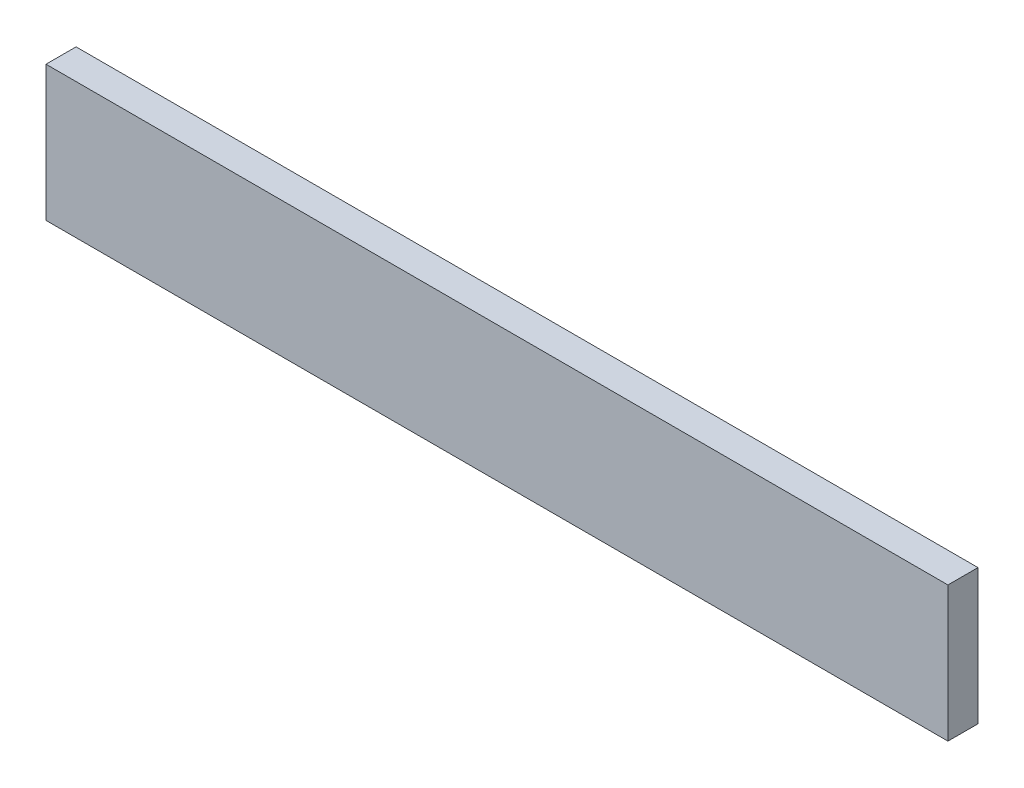
ISO-10303-21;
HEADER;
FILE_DESCRIPTION(('STEP AP214'),'2;1');
FILE_NAME('part.step','',(''),(''),'','','');
FILE_SCHEMA(('AUTOMOTIVE_DESIGN { 1 0 10303 214 1 1 1 1 }'));
ENDSEC;
DATA;
#1=APPLICATION_CONTEXT('core data for automotive mechanical design processes');
#2=APPLICATION_PROTOCOL_DEFINITION('international standard','automotive_design',2000,#1);
#3=PRODUCT_CONTEXT('',#1,'mechanical');
#4=PRODUCT('Part','Part','',(#3));
#5=PRODUCT_RELATED_PRODUCT_CATEGORY('part','',(#4));
#6=PRODUCT_DEFINITION_FORMATION('','',#4);
#7=PRODUCT_DEFINITION_CONTEXT('part definition',#1,'design');
#8=PRODUCT_DEFINITION('design','',#6,#7);
#9=PRODUCT_DEFINITION_SHAPE('','',#8);
#10=(LENGTH_UNIT() NAMED_UNIT(*) SI_UNIT(.MILLI.,.METRE.));
#11=(NAMED_UNIT(*) PLANE_ANGLE_UNIT() SI_UNIT($,.RADIAN.));
#12=(NAMED_UNIT(*) SI_UNIT($,.STERADIAN.) SOLID_ANGLE_UNIT());
#13=UNCERTAINTY_MEASURE_WITH_UNIT(LENGTH_MEASURE(1.E-05),#10,'distance_accuracy_value','');
#14=(GEOMETRIC_REPRESENTATION_CONTEXT(3) GLOBAL_UNCERTAINTY_ASSIGNED_CONTEXT((#13)) GLOBAL_UNIT_ASSIGNED_CONTEXT((#10,
#11,#12)) REPRESENTATION_CONTEXT('',''));
#15=CARTESIAN_POINT('',(0.,0.,0.));
#16=DIRECTION('',(0.,0.,1.));
#17=DIRECTION('',(1.,0.,0.));
#18=AXIS2_PLACEMENT_3D('',#15,#16,#17);
#19=CARTESIAN_POINT('',(-439.049402450625,4426.93965889721,5.08));
#20=DIRECTION('',(-1.,0.,0.));
#21=DIRECTION('',(0.,0.,1.));
#22=AXIS2_PLACEMENT_3D('',#19,#20,#21);
#23=PLANE('',#22);
#24=DIRECTION('',(0.,1.,0.));
#25=VECTOR('',#24,1.);
#26=CARTESIAN_POINT('',(-439.049402450625,4426.93965889721,0.));
#27=LINE('',#26,#25);
#28=CARTESIAN_POINT('',(-439.049402450625,4404.07965889721,0.));
#29=VERTEX_POINT('',#28);
#30=CARTESIAN_POINT('',(-439.049402450625,4426.93965889721,0.));
#31=VERTEX_POINT('',#30);
#32=EDGE_CURVE('E106',#29,#31,#27,.T.);
#33=ORIENTED_EDGE('',*,*,#32,.T.);
#34=DIRECTION('',(0.,0.,-1.));
#35=VECTOR('',#34,1.);
#36=CARTESIAN_POINT('',(-439.049402450625,4426.93965889721,5.08));
#37=LINE('',#36,#35);
#38=CARTESIAN_POINT('',(-439.049402450625,4426.93965889721,5.08));
#39=VERTEX_POINT('',#38);
#40=EDGE_CURVE('E11',#39,#31,#37,.T.);
#41=ORIENTED_EDGE('',*,*,#40,.F.);
#42=DIRECTION('',(0.,1.,0.));
#43=VECTOR('',#42,1.);
#44=CARTESIAN_POINT('',(-439.049402450625,4426.93965889721,5.08));
#45=LINE('',#44,#43);
#46=CARTESIAN_POINT('',(-439.049402450625,4404.07965889721,5.08));
#47=VERTEX_POINT('',#46);
#48=EDGE_CURVE('E94',#47,#39,#45,.T.);
#49=ORIENTED_EDGE('',*,*,#48,.F.);
#50=DIRECTION('',(0.,0.,-1.));
#51=VECTOR('',#50,1.);
#52=CARTESIAN_POINT('',(-439.049402450625,4404.07965889721,5.08));
#53=LINE('',#52,#51);
#54=EDGE_CURVE('E102',#47,#29,#53,.T.);
#55=ORIENTED_EDGE('',*,*,#54,.T.);
#56=EDGE_LOOP('',(#33,#41,#49,#55));
#57=FACE_BOUND('',#56,.T.);
#58=ADVANCED_FACE('F43',(#57),#23,.F.);
#59=CARTESIAN_POINT('',(-591.449402450623,4426.93965889721,5.08));
#60=DIRECTION('',(0.,-1.,0.));
#61=DIRECTION('',(0.,0.,-1.));
#62=AXIS2_PLACEMENT_3D('',#59,#60,#61);
#63=PLANE('',#62);
#64=DIRECTION('',(-1.,0.,0.));
#65=VECTOR('',#64,1.);
#66=CARTESIAN_POINT('',(-591.449402450623,4426.93965889721,0.));
#67=LINE('',#66,#65);
#68=CARTESIAN_POINT('',(-591.449402450623,4426.93965889721,0.));
#69=VERTEX_POINT('',#68);
#70=EDGE_CURVE('E98',#31,#69,#67,.T.);
#71=ORIENTED_EDGE('',*,*,#70,.T.);
#72=DIRECTION('',(0.,0.,-1.));
#73=VECTOR('',#72,1.);
#74=CARTESIAN_POINT('',(-591.449402450623,4426.93965889721,5.08));
#75=LINE('',#74,#73);
#76=CARTESIAN_POINT('',(-591.449402450623,4426.93965889721,5.08));
#77=VERTEX_POINT('',#76);
#78=EDGE_CURVE('E51',#77,#69,#75,.T.);
#79=ORIENTED_EDGE('',*,*,#78,.F.);
#80=DIRECTION('',(-1.,0.,0.));
#81=VECTOR('',#80,1.);
#82=CARTESIAN_POINT('',(-591.449402450623,4426.93965889721,5.08));
#83=LINE('',#82,#81);
#84=EDGE_CURVE('E89',#39,#77,#83,.T.);
#85=ORIENTED_EDGE('',*,*,#84,.F.);
#86=ORIENTED_EDGE('',*,*,#40,.T.);
#87=EDGE_LOOP('',(#71,#79,#85,#86));
#88=FACE_BOUND('',#87,.T.);
#89=ADVANCED_FACE('F97',(#88),#63,.F.);
#90=CARTESIAN_POINT('',(-591.449402450623,4426.93965889721,5.08));
#91=DIRECTION('',(1.,0.,0.));
#92=DIRECTION('',(0.,0.,-1.));
#93=AXIS2_PLACEMENT_3D('',#90,#91,#92);
#94=PLANE('',#93);
#95=DIRECTION('',(0.,-1.,0.));
#96=VECTOR('',#95,1.);
#97=CARTESIAN_POINT('',(-591.449402450623,4426.93965889721,0.));
#98=LINE('',#97,#96);
#99=CARTESIAN_POINT('',(-591.449402450623,4404.07965889721,0.));
#100=VERTEX_POINT('',#99);
#101=EDGE_CURVE('E76',#69,#100,#98,.T.);
#102=ORIENTED_EDGE('',*,*,#101,.T.);
#103=DIRECTION('',(0.,0.,-1.));
#104=VECTOR('',#103,1.);
#105=CARTESIAN_POINT('',(-591.449402450623,4404.07965889721,5.08));
#106=LINE('',#105,#104);
#107=CARTESIAN_POINT('',(-591.449402450623,4404.07965889721,5.08));
#108=VERTEX_POINT('',#107);
#109=EDGE_CURVE('E99',#108,#100,#106,.T.);
#110=ORIENTED_EDGE('',*,*,#109,.F.);
#111=DIRECTION('',(0.,-1.,0.));
#112=VECTOR('',#111,1.);
#113=CARTESIAN_POINT('',(-591.449402450623,4426.93965889721,5.08));
#114=LINE('',#113,#112);
#115=EDGE_CURVE('E92',#77,#108,#114,.T.);
#116=ORIENTED_EDGE('',*,*,#115,.F.);
#117=ORIENTED_EDGE('',*,*,#78,.T.);
#118=EDGE_LOOP('',(#102,#110,#116,#117));
#119=FACE_BOUND('',#118,.T.);
#120=ADVANCED_FACE('F100',(#119),#94,.F.);
#121=CARTESIAN_POINT('',(-591.449402450623,4404.07965889721,5.08));
#122=DIRECTION('',(0.,1.,0.));
#123=DIRECTION('',(0.,0.,1.));
#124=AXIS2_PLACEMENT_3D('',#121,#122,#123);
#125=PLANE('',#124);
#126=DIRECTION('',(1.,0.,0.));
#127=VECTOR('',#126,1.);
#128=CARTESIAN_POINT('',(-591.449402450623,4404.07965889721,0.));
#129=LINE('',#128,#127);
#130=EDGE_CURVE('E82',#100,#29,#129,.T.);
#131=ORIENTED_EDGE('',*,*,#130,.T.);
#132=ORIENTED_EDGE('',*,*,#54,.F.);
#133=DIRECTION('',(1.,0.,0.));
#134=VECTOR('',#133,1.);
#135=CARTESIAN_POINT('',(-591.449402450623,4404.07965889721,5.08));
#136=LINE('',#135,#134);
#137=EDGE_CURVE('E59',#108,#47,#136,.T.);
#138=ORIENTED_EDGE('',*,*,#137,.F.);
#139=ORIENTED_EDGE('',*,*,#109,.T.);
#140=EDGE_LOOP('',(#131,#132,#138,#139));
#141=FACE_BOUND('',#140,.T.);
#142=ADVANCED_FACE('F113',(#141),#125,.F.);
#143=CARTESIAN_POINT('',(0.,0.,5.08));
#144=DIRECTION('',(0.,0.,1.));
#145=DIRECTION('',(1.,0.,0.));
#146=AXIS2_PLACEMENT_3D('',#143,#144,#145);
#147=PLANE('',#146);
#148=ORIENTED_EDGE('',*,*,#48,.T.);
#149=ORIENTED_EDGE('',*,*,#84,.T.);
#150=ORIENTED_EDGE('',*,*,#115,.T.);
#151=ORIENTED_EDGE('',*,*,#137,.T.);
#152=EDGE_LOOP('',(#148,#149,#150,#151));
#153=FACE_BOUND('',#152,.T.);
#154=ADVANCED_FACE('F90',(#153),#147,.T.);
#155=CARTESIAN_POINT('',(0.,0.,0.));
#156=DIRECTION('',(0.,0.,1.));
#157=DIRECTION('',(1.,0.,0.));
#158=AXIS2_PLACEMENT_3D('',#155,#156,#157);
#159=PLANE('',#158);
#160=ORIENTED_EDGE('',*,*,#32,.F.);
#161=ORIENTED_EDGE('',*,*,#130,.F.);
#162=ORIENTED_EDGE('',*,*,#101,.F.);
#163=ORIENTED_EDGE('',*,*,#70,.F.);
#164=EDGE_LOOP('',(#160,#161,#162,#163));
#165=FACE_BOUND('',#164,.T.);
#166=ADVANCED_FACE('F116',(#165),#159,.F.);
#167=CLOSED_SHELL('',(#58,#89,#120,#142,#154,#166));
#168=MANIFOLD_SOLID_BREP('B2',#167);
#169=ADVANCED_BREP_SHAPE_REPRESENTATION('',(#18,#168),#14);
#170=SHAPE_DEFINITION_REPRESENTATION(#9,#169);
ENDSEC;
END-ISO-10303-21;
